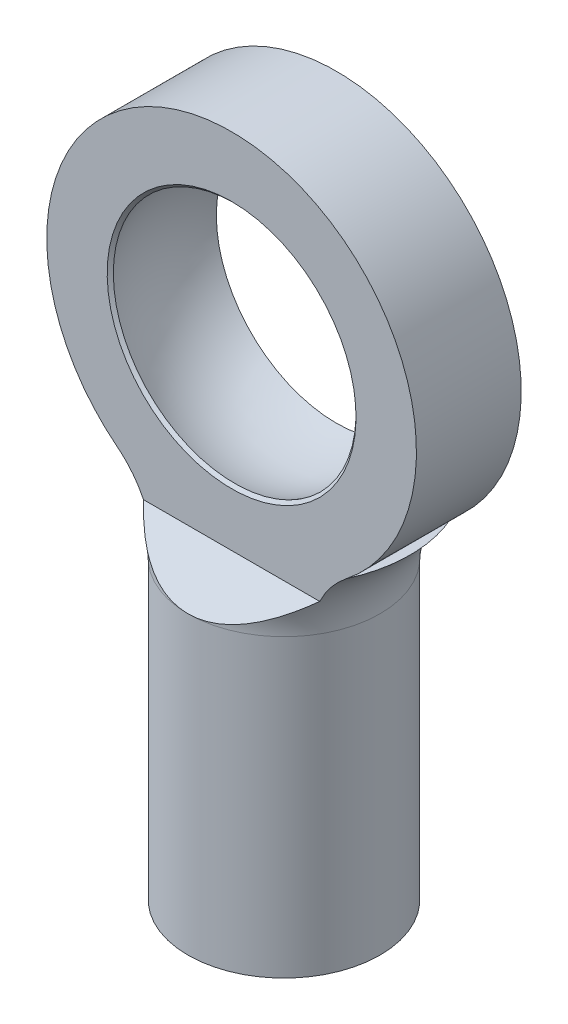
ISO-10303-21;
HEADER;
FILE_DESCRIPTION(('STEP AP214'),'2;1');
FILE_NAME('part.step','',(''),(''),'','','');
FILE_SCHEMA(('AUTOMOTIVE_DESIGN { 1 0 10303 214 1 1 1 1 }'));
ENDSEC;
DATA;
#1=APPLICATION_CONTEXT('core data for automotive mechanical design processes');
#2=APPLICATION_PROTOCOL_DEFINITION('international standard','automotive_design',2000,#1);
#3=PRODUCT_CONTEXT('',#1,'mechanical');
#4=PRODUCT('Part','Part','',(#3));
#5=PRODUCT_RELATED_PRODUCT_CATEGORY('part','',(#4));
#6=PRODUCT_DEFINITION_FORMATION('','',#4);
#7=PRODUCT_DEFINITION_CONTEXT('part definition',#1,'design');
#8=PRODUCT_DEFINITION('design','',#6,#7);
#9=PRODUCT_DEFINITION_SHAPE('','',#8);
#10=(LENGTH_UNIT() NAMED_UNIT(*) SI_UNIT(.MILLI.,.METRE.));
#11=(NAMED_UNIT(*) PLANE_ANGLE_UNIT() SI_UNIT($,.RADIAN.));
#12=(NAMED_UNIT(*) SI_UNIT($,.STERADIAN.) SOLID_ANGLE_UNIT());
#13=UNCERTAINTY_MEASURE_WITH_UNIT(LENGTH_MEASURE(1.E-05),#10,'distance_accuracy_value','');
#14=(GEOMETRIC_REPRESENTATION_CONTEXT(3) GLOBAL_UNCERTAINTY_ASSIGNED_CONTEXT((#13)) GLOBAL_UNIT_ASSIGNED_CONTEXT((#10,
#11,#12)) REPRESENTATION_CONTEXT('',''));
#15=CARTESIAN_POINT('',(0.,0.,0.));
#16=DIRECTION('',(0.,0.,1.));
#17=DIRECTION('',(1.,0.,0.));
#18=AXIS2_PLACEMENT_3D('',#15,#16,#17);
#19=CARTESIAN_POINT('',(0.,8.46365176617518,0.));
#20=DIRECTION('',(0.,1.,0.));
#21=DIRECTION('',(0.,0.,1.));
#22=AXIS2_PLACEMENT_3D('',#19,#20,#21);
#23=TOROIDAL_SURFACE('',#22,5.25,2.5);
#24=CARTESIAN_POINT('',(2.52263360876698,9.40698208641616,1.4998));
#25=CARTESIAN_POINT('',(2.43420646961524,9.33691709001427,1.59265746108454));
#26=CARTESIAN_POINT('',(2.34248853626167,9.26818785259467,1.6837446346634));
#27=CARTESIAN_POINT('',(2.15012625601884,9.13447870724579,1.86094997825127));
#28=CARTESIAN_POINT('',(2.04941602731006,9.0695334142214,1.9470222729681));
#29=CARTESIAN_POINT('',(1.83580879928051,8.94430923676506,2.11298244969169));
#30=CARTESIAN_POINT('',(1.72269520534484,8.88416177953119,2.19269615063005));
#31=CARTESIAN_POINT('',(1.48551246500342,8.77271586216841,2.34039593605765));
#32=CARTESIAN_POINT('',(1.36148416179799,8.72138637002678,2.40842314741569));
#33=CARTESIAN_POINT('',(1.11450193706548,8.634654124027,2.52336979083666));
#34=CARTESIAN_POINT('',(0.992597122249493,8.59819301253292,2.57169186912865));
#35=CARTESIAN_POINT('',(0.804178160819459,8.55252332283294,2.63221811835207));
#36=CARTESIAN_POINT('',(0.74061577938278,8.53882754364144,2.65036919733026));
#37=CARTESIAN_POINT('',(0.611834103747568,8.51466087405115,2.6823973953787));
#38=CARTESIAN_POINT('',(0.546615542220467,8.50418858362975,2.69627636990534));
#39=CARTESIAN_POINT('',(0.414232154763943,8.48662523804074,2.71955315236874));
#40=CARTESIAN_POINT('',(0.34705426945471,8.47956971916032,2.72890386390111));
#41=CARTESIAN_POINT('',(0.211933281308076,8.46918817654625,2.74266256994248));
#42=CARTESIAN_POINT('',(0.14399051653232,8.46586056583602,2.74707266767883));
#43=CARTESIAN_POINT('',(0.00778756896621926,8.46302327061933,2.75083294804277));
#44=CARTESIAN_POINT('',(-0.060472920435387,8.46351880170383,2.75017621842373));
#45=CARTESIAN_POINT('',(-0.19660369244508,8.46831898046119,2.74381451950058));
#46=CARTESIAN_POINT('',(-0.264473990150006,8.47262347974997,2.73810974685057));
#47=CARTESIAN_POINT('',(-0.455322252936812,8.49006323280162,2.71499676214379));
#48=CARTESIAN_POINT('',(-0.577262266475379,8.50756327091419,2.69180388136927));
#49=CARTESIAN_POINT('',(-0.815082505299224,8.55352538282223,2.63089008365232));
#50=CARTESIAN_POINT('',(-0.930963643154768,8.58198580036387,2.59317136175067));
#51=CARTESIAN_POINT('',(-1.20939301297771,8.66390463227651,2.48460395809611));
#52=CARTESIAN_POINT('',(-1.36751851057227,8.72280025637074,2.40654931735925));
#53=CARTESIAN_POINT('',(-1.66690333740199,8.8548923072355,2.23148711650798));
#54=CARTESIAN_POINT('',(-1.80807468477703,8.92815854101835,2.13438704083997));
#55=CARTESIAN_POINT('',(-2.04767221432566,9.06842671254516,1.94848898977549));
#56=CARTESIAN_POINT('',(-2.14896828331774,9.13369750516558,1.86198530895116));
#57=CARTESIAN_POINT('',(-2.34208982908815,9.26788748190653,1.68414271731403));
#58=CARTESIAN_POINT('',(-2.43400878357452,9.33675753578726,1.59286891903339));
#59=CARTESIAN_POINT('',(-2.52263360876698,9.40698208641616,1.4998));
#60=B_SPLINE_CURVE_WITH_KNOTS('',3,(#24,#25,#26,#27,#28,#29,#30,#31,#32,#33,#34,#35,#36,#37,#38,
#39,#40,#41,#42,#43,#44,#45,#46,#47,#48,#49,#50,#51,#52,#53,#54,#55,#56,#57,#58,#59),
.UNSPECIFIED.,.F.,.F.,(4,2,2,2,2,2,2,2,2,2,2,2,2,2,2,2,2,4),(0.,0.438649435214271,
0.880828099093525,1.33257745542061,1.78270292227348,2.18943457857803,2.39176026146898,
2.59399794606545,2.79829610062513,3.0025072520403,3.20699704077256,3.41147886364837,
3.78575683276633,4.15997826586447,4.71454165414465,5.27186877583573,5.71644932768592,
6.15604355948166),.UNSPECIFIED.);
#61=CARTESIAN_POINT('',(-8.2650900012915E-12,8.46365176617518,2.75));
#62=VERTEX_POINT('',#61);
#63=CARTESIAN_POINT('',(-2.52244315909278,9.40683117771543,1.49999999999321));
#64=VERTEX_POINT('',#63);
#65=EDGE_CURVE('E182',#62,#64,#60,.T.);
#66=ORIENTED_EDGE('',*,*,#65,.T.);
#67=CARTESIAN_POINT('',(-2.77520054373101,9.82727055229815,1.5));
#68=CARTESIAN_POINT('',(-2.86880798947521,9.95380541119137,1.5));
#69=CARTESIAN_POINT('',(-2.97382506706745,10.0721303335961,1.5));
#70=CARTESIAN_POINT('',(-3.20236643724194,10.2896798704027,1.5));
#71=CARTESIAN_POINT('',(-3.32593956265058,10.3888524595779,1.5));
#72=CARTESIAN_POINT('',(-3.58740941147698,10.5653509574533,1.5));
#73=CARTESIAN_POINT('',(-3.72527160981674,10.6427279194851,1.5));
#74=CARTESIAN_POINT('',(-4.01174098843791,10.7737187344324,1.5));
#75=CARTESIAN_POINT('',(-4.16034032384121,10.8273497366869,1.5));
#76=CARTESIAN_POINT('',(-4.46748460299527,10.9098871456197,1.5));
#77=CARTESIAN_POINT('',(-4.62616892097153,10.9382782667874,1.5));
#78=CARTESIAN_POINT('',(-4.94610453208784,10.9670155786189,1.5));
#79=CARTESIAN_POINT('',(-5.10735590875208,10.967360854884,1.5));
#80=CARTESIAN_POINT('',(-5.42192086971607,10.9398059535283,1.5));
#81=CARTESIAN_POINT('',(-5.57531804169709,10.9128647009825,1.5));
#82=CARTESIAN_POINT('',(-5.87498986714995,10.8324257276257,1.5));
#83=CARTESIAN_POINT('',(-6.02126642881333,10.7789351650378,1.5));
#84=CARTESIAN_POINT('',(-6.29580090034785,10.6494857550717,1.5));
#85=CARTESIAN_POINT('',(-6.42456452256022,10.5745988452261,1.5));
#86=CARTESIAN_POINT('',(-6.6670897667117,10.4035459774789,1.5));
#87=CARTESIAN_POINT('',(-6.78085443602482,10.3073843526789,1.5));
#88=CARTESIAN_POINT('',(-6.98607910131235,10.1001251056968,1.5));
#89=CARTESIAN_POINT('',(-7.07816861114006,9.98965041030686,1.5));
#90=CARTESIAN_POINT('',(-7.24198175580442,9.75451040876,1.5));
#91=CARTESIAN_POINT('',(-7.31370816219457,9.62984703701489,1.5));
#92=CARTESIAN_POINT('',(-7.43313524406139,9.37291285809918,1.5));
#93=CARTESIAN_POINT('',(-7.48133976600618,9.24087606158923,1.5));
#94=CARTESIAN_POINT('',(-7.55459367515231,8.97052922637443,1.5));
#95=CARTESIAN_POINT('',(-7.57964491871713,8.83221969153273,1.5));
#96=CARTESIAN_POINT('',(-7.60565180707718,8.55503757836966,1.5));
#97=CARTESIAN_POINT('',(-7.60689355342739,8.41619176605415,1.5));
#98=CARTESIAN_POINT('',(-7.58597634289377,8.1402774483205,1.5));
#99=CARTESIAN_POINT('',(-7.563818114773,8.00320888768664,1.5));
#100=CARTESIAN_POINT('',(-7.49687562817931,7.73512547110418,1.5));
#101=CARTESIAN_POINT('',(-7.45215462723152,7.60409480194225,1.5));
#102=CARTESIAN_POINT('',(-7.34147549722097,7.35133957544266,1.5));
#103=CARTESIAN_POINT('',(-7.27551714570415,7.22961511560091,1.5));
#104=CARTESIAN_POINT('',(-7.12387899488294,6.99810068682845,1.5));
#105=CARTESIAN_POINT('',(-7.03808317065674,6.88838675698003,1.5));
#106=CARTESIAN_POINT('',(-6.84953999725341,6.68465892661047,1.5));
#107=CARTESIAN_POINT('',(-6.74679175461202,6.59064585411681,1.5));
#108=CARTESIAN_POINT('',(-6.52565033229582,6.4194015986411,1.5));
#109=CARTESIAN_POINT('',(-6.40704380590824,6.34244609678727,1.5));
#110=CARTESIAN_POINT('',(-6.15884729547815,6.20898713767554,1.5));
#111=CARTESIAN_POINT('',(-6.02925628800726,6.15248558871104,1.5));
#112=CARTESIAN_POINT('',(-5.75932248071202,6.0599411383845,1.5));
#113=CARTESIAN_POINT('',(-5.61879126688184,6.02444837654625,1.5));
#114=CARTESIAN_POINT('',(-5.33384831810342,5.97668574538999,1.5));
#115=CARTESIAN_POINT('',(-5.18943597569307,5.96441953314131,1.5));
#116=CARTESIAN_POINT('',(-4.8953594391388,5.96292805390488,1.5));
#117=CARTESIAN_POINT('',(-4.74569122046875,5.97453820487662,1.5));
#118=CARTESIAN_POINT('',(-4.45017719081841,6.02165792578331,1.5));
#119=CARTESIAN_POINT('',(-4.3043321014034,6.0571719739996,1.5));
#120=CARTESIAN_POINT('',(-4.0140268684584,6.15274664286522,1.5));
#121=CARTESIAN_POINT('',(-3.86988871883762,6.21378587844086,1.5));
#122=CARTESIAN_POINT('',(-3.59340112230231,6.35846727918727,1.5));
#123=CARTESIAN_POINT('',(-3.46105594439179,6.44211758562454,1.5));
#124=CARTESIAN_POINT('',(-3.20791018754112,6.63279289406282,1.5));
#125=CARTESIAN_POINT('',(-3.08758900063503,6.7404568810613,1.5));
#126=CARTESIAN_POINT('',(-2.86736160654152,6.97509890635906,1.5));
#127=CARTESIAN_POINT('',(-2.76746281009798,7.10208392669649,1.5));
#128=CARTESIAN_POINT('',(-2.59605067812521,7.36789588024765,1.5));
#129=CARTESIAN_POINT('',(-2.52365681131358,7.50614362139373,1.5));
#130=CARTESIAN_POINT('',(-2.43670549947174,7.72193847798248,1.5));
#131=CARTESIAN_POINT('',(-2.41133376282467,7.79524495987107,1.5));
#132=CARTESIAN_POINT('',(-2.36834857550259,7.94411977978145,1.5));
#133=CARTESIAN_POINT('',(-2.35073326437184,8.01968757075651,1.5));
#134=CARTESIAN_POINT('',(-2.32574664143934,8.16110337264975,1.5));
#135=CARTESIAN_POINT('',(-2.31725344935535,8.22675543213059,1.5));
#136=CARTESIAN_POINT('',(-2.30648264596507,8.3585651538826,1.5));
#137=CARTESIAN_POINT('',(-2.30420423543323,8.42472275004395,1.5));
#138=CARTESIAN_POINT('',(-2.30592084310208,8.55696206180351,1.5));
#139=CARTESIAN_POINT('',(-2.30991621870201,8.62304377286416,1.5));
#140=CARTESIAN_POINT('',(-2.32407538106441,8.7545237966183,1.5));
#141=CARTESIAN_POINT('',(-2.33423889655187,8.81992213923771,1.5));
#142=CARTESIAN_POINT('',(-2.37098053060611,9.00105122056472,1.5));
#143=CARTESIAN_POINT('',(-2.40418453837801,9.11548852572648,1.5));
#144=CARTESIAN_POINT('',(-2.48771610718511,9.33771626447226,1.5));
#145=CARTESIAN_POINT('',(-2.53802751481908,9.44551285544807,1.5));
#146=CARTESIAN_POINT('',(-2.62255611721408,9.59736306870057,1.5));
#147=CARTESIAN_POINT('',(-2.65101768207202,9.64471203174347,1.5));
#148=CARTESIAN_POINT('',(-2.7109186076383,9.73746744652141,1.5));
#149=CARTESIAN_POINT('',(-2.74235729104561,9.78287433668623,1.5));
#150=CARTESIAN_POINT('',(-2.77520054373101,9.82727055229815,1.5));
#151=B_SPLINE_CURVE_WITH_KNOTS('',3,(#67,#68,#69,#70,#71,#72,#73,#74,#75,#76,#77,#78,#79,#80,
#81,#82,#83,#84,#85,#86,#87,#88,#89,#90,#91,#92,#93,#94,#95,#96,#97,#98,#99,#100,#101,#102,#103,
#104,#105,#106,#107,#108,#109,#110,#111,#112,#113,#114,#115,#116,#117,#118,#119,#120,#121,#122,
#123,#124,#125,#126,#127,#128,#129,#130,#131,#132,#133,#134,#135,#136,#137,#138,#139,#140,#141,
#142,#143,#144,#145,#146,#147,#148,#149,#150),.UNSPECIFIED.,.T.,.F.,(4,2,2,2,2,2,2,2,2,2,2,2,2,
2,2,2,2,2,2,2,2,2,2,2,2,2,2,2,2,2,2,2,2,2,2,2,2,2,2,2,2,4),(0.,0.471976963857071,
0.945218504166764,1.41734214257615,1.88912425477586,2.37033044137583,2.85155231707796,
3.31643006210589,3.78118253485925,4.22583228867175,4.67039156222801,5.09975432353878,
5.52905861768114,5.94871225437454,6.36833224152265,6.78290675548257,7.19746835841636,
7.61087409220699,8.02428415642337,8.44017622583875,8.85609022153378,9.27830229258901,
9.70055374463809,10.1334223929888,10.5663591917575,11.0147015633729,11.4631279531847,
11.93060273411,12.398246057164,12.880251707864,13.3624319563729,13.8275232209248,
14.0598949739912,14.2922109599811,14.4905292640561,14.6888220630464,14.8871261586072,
15.0854215333785,15.4412666911813,15.7967767763951,15.962412933836,16.1280114988049),.UNSPECIFIED.);
#152=CARTESIAN_POINT('',(-3.28292368029246,10.3500105892454,1.5));
#153=VERTEX_POINT('',#152);
#154=EDGE_CURVE('E123',#64,#153,#151,.T.);
#155=ORIENTED_EDGE('',*,*,#154,.T.);
#156=CARTESIAN_POINT('',(0.,10.3500105892454,0.));
#157=DIRECTION('',(0.,1.,0.));
#158=DIRECTION('',(0.,0.,1.));
#159=AXIS2_PLACEMENT_3D('',#156,#157,#158);
#160=CIRCLE('',#159,3.609375);
#161=CARTESIAN_POINT('',(-3.28292368029246,10.3500105892454,-1.5));
#162=VERTEX_POINT('',#161);
#163=EDGE_CURVE('E72',#162,#153,#160,.T.);
#164=ORIENTED_EDGE('',*,*,#163,.F.);
#165=CARTESIAN_POINT('',(-2.77520054373101,9.82727055229815,-1.5));
#166=CARTESIAN_POINT('',(-2.69722034650861,9.72186186116174,-1.5));
#167=CARTESIAN_POINT('',(-2.62706139265087,9.61064779976969,-1.5));
#168=CARTESIAN_POINT('',(-2.50530030107028,9.37833661741164,-1.5));
#169=CARTESIAN_POINT('',(-2.45369290972097,9.25724230637637,-1.5));
#170=CARTESIAN_POINT('',(-2.3924360207345,9.06997176813836,-1.5));
#171=CARTESIAN_POINT('',(-2.37467475666705,9.00636920123968,-1.5));
#172=CARTESIAN_POINT('',(-2.34498059489164,8.87782802698144,-1.5));
#173=CARTESIAN_POINT('',(-2.33304503535153,8.8128900439502,-1.5));
#174=CARTESIAN_POINT('',(-2.31526983974161,8.68221169683337,-1.5));
#175=CARTESIAN_POINT('',(-2.30942735265512,8.61647172258986,-1.5));
#176=CARTESIAN_POINT('',(-2.30395456671406,8.4847531751108,-1.5));
#177=CARTESIAN_POINT('',(-2.30432379631015,8.41877462036674,-1.5));
#178=CARTESIAN_POINT('',(-2.31419008285242,8.23255403516505,-1.5));
#179=CARTESIAN_POINT('',(-2.33099325004656,8.11262477694962,-1.5));
#180=CARTESIAN_POINT('',(-2.38420631342782,7.87727413581764,-1.5));
#181=CARTESIAN_POINT('',(-2.42062521093435,7.76185484854868,-1.5));
#182=CARTESIAN_POINT('',(-2.51154920487191,7.53618351220007,-1.5));
#183=CARTESIAN_POINT('',(-2.5663467685798,7.42605025810996,-1.5));
#184=CARTESIAN_POINT('',(-2.69131596910597,7.21492813038099,-1.5));
#185=CARTESIAN_POINT('',(-2.7614930688756,7.11394252413046,-1.5));
#186=CARTESIAN_POINT('',(-2.92628460654182,6.90834392927876,-1.5));
#187=CARTESIAN_POINT('',(-3.02297704222449,6.80539494114581,-1.5));
#188=CARTESIAN_POINT('',(-3.23065794842618,6.61508249080304,-1.5));
#189=CARTESIAN_POINT('',(-3.3416540953024,6.52772745786798,-1.5));
#190=CARTESIAN_POINT('',(-3.58876728132312,6.36116685082386,-1.5));
#191=CARTESIAN_POINT('',(-3.72630522698038,6.28405850344012,-1.5));
#192=CARTESIAN_POINT('',(-4.0121818308107,6.15342791569902,-1.5));
#193=CARTESIAN_POINT('',(-4.16052239081474,6.09990984023008,-1.5));
#194=CARTESIAN_POINT('',(-4.46740851493264,6.01743175994389,-1.5));
#195=CARTESIAN_POINT('',(-4.62610623958721,5.98903391648114,-1.5));
#196=CARTESIAN_POINT('',(-4.94603939287148,5.96029078631035,-1.5));
#197=CARTESIAN_POINT('',(-5.10727443959866,5.95994131756622,-1.5));
#198=CARTESIAN_POINT('',(-5.42182291832866,5.98748342031241,-1.5));
#199=CARTESIAN_POINT('',(-5.57521966679189,6.01441864767564,-1.5));
#200=CARTESIAN_POINT('',(-5.87489596592004,6.09484638577298,-1.5));
#201=CARTESIAN_POINT('',(-6.02117722625271,6.14833248206549,-1.5));
#202=CARTESIAN_POINT('',(-6.29571958434771,6.27777352749429,-1.5));
#203=CARTESIAN_POINT('',(-6.4244865206929,6.35265617083908,-1.5));
#204=CARTESIAN_POINT('',(-6.66701889819784,6.52370108136527,-1.5));
#205=CARTESIAN_POINT('',(-6.78078740538716,6.61985898858738,-1.5));
#206=CARTESIAN_POINT('',(-6.98602017953239,6.82711167495004,-1.5));
#207=CARTESIAN_POINT('',(-7.07811394054991,6.93758350249161,-1.5));
#208=CARTESIAN_POINT('',(-7.24193587049002,7.172718413161,-1.5));
#209=CARTESIAN_POINT('',(-7.31366683731026,7.29737954334314,-1.5));
#210=CARTESIAN_POINT('',(-7.43310317558629,7.55431000148409,-1.5));
#211=CARTESIAN_POINT('',(-7.48131240603414,7.68634529142251,-1.5));
#212=CARTESIAN_POINT('',(-7.55457592855433,7.95669003412192,-1.5));
#213=CARTESIAN_POINT('',(-7.57963206094283,8.09499898730599,-1.5));
#214=CARTESIAN_POINT('',(-7.60564863458145,8.3721806081364,-1.5));
#215=CARTESIAN_POINT('',(-7.60689520689484,8.51102649697411,-1.5));
#216=CARTESIAN_POINT('',(-7.58598754395391,8.78694174686641,-1.5));
#217=CARTESIAN_POINT('',(-7.56383404244838,8.92401116348888,-1.5));
#218=CARTESIAN_POINT('',(-7.49690078498283,9.19209694618953,-1.5));
#219=CARTESIAN_POINT('',(-7.45218430659433,9.32312912817396,-1.5));
#220=CARTESIAN_POINT('',(-7.34151388165661,9.5758881168649,-1.5));
#221=CARTESIAN_POINT('',(-7.27555971058974,9.69761482518027,-1.5));
#222=CARTESIAN_POINT('',(-7.12392951934685,9.92913435850688,-1.5));
#223=CARTESIAN_POINT('',(-7.03813747980046,10.0388511537427,-1.5));
#224=CARTESIAN_POINT('',(-6.84960142419803,10.242585167419,-1.5));
#225=CARTESIAN_POINT('',(-6.74685653251839,10.3366015744214,-1.5));
#226=CARTESIAN_POINT('',(-6.52572170050084,10.5078526963465,-1.5));
#227=CARTESIAN_POINT('',(-6.40711846141554,10.5848118113331,-1.5));
#228=CARTESIAN_POINT('',(-6.15892702750739,10.7182790010088,-1.5));
#229=CARTESIAN_POINT('',(-6.02933773183651,10.7747850232171,-1.5));
#230=CARTESIAN_POINT('',(-5.75940481341771,10.8673392868139,-1.5));
#231=CARTESIAN_POINT('',(-5.61887265417873,10.9028370904131,-1.5));
#232=CARTESIAN_POINT('',(-5.33393196857855,10.9506081882319,-1.5));
#233=CARTESIAN_POINT('',(-5.18952297244285,10.962878654886,-1.5));
#234=CARTESIAN_POINT('',(-4.89546202112646,10.9643800314809,-1.5));
#235=CARTESIAN_POINT('',(-4.74580603691271,10.9527770745068,-1.5));
#236=CARTESIAN_POINT('',(-4.45029018008411,10.9056701832517,-1.5));
#237=CARTESIAN_POINT('',(-4.30443162669497,10.8701580550426,-1.5));
#238=CARTESIAN_POINT('',(-4.01407176333231,10.774578202881,-1.5));
#239=CARTESIAN_POINT('',(-3.86989453295576,10.7135264190289,-1.5));
#240=CARTESIAN_POINT('',(-3.5933968767176,10.5688283072943,-1.5));
#241=CARTESIAN_POINT('',(-3.46107354340499,10.4851875402164,-1.5));
#242=CARTESIAN_POINT('',(-3.23014683330539,10.3112697479837,-1.5));
#243=CARTESIAN_POINT('',(-3.12944408304694,10.2237640109109,-1.5));
#244=CARTESIAN_POINT('',(-2.94154436047935,10.0352535774415,-1.5));
#245=CARTESIAN_POINT('',(-2.85434426126542,9.93425201649195,-1.5));
#246=CARTESIAN_POINT('',(-2.77520054373101,9.82727055229815,-1.5));
#247=B_SPLINE_CURVE_WITH_KNOTS('',3,(#165,#166,#167,#168,#169,#170,#171,#172,#173,#174,#175,
#176,#177,#178,#179,#180,#181,#182,#183,#184,#185,#186,#187,#188,#189,#190,#191,#192,#193,#194,
#195,#196,#197,#198,#199,#200,#201,#202,#203,#204,#205,#206,#207,#208,#209,#210,#211,#212,#213,
#214,#215,#216,#217,#218,#219,#220,#221,#222,#223,#224,#225,#226,#227,#228,#229,#230,#231,#232,
#233,#234,#235,#236,#237,#238,#239,#240,#241,#242,#243,#244,#245,#246),.UNSPECIFIED.,.T.,.F.,(4,
2,2,2,2,2,2,2,2,2,2,2,2,2,2,2,2,2,2,2,2,2,2,2,2,2,2,2,2,2,2,2,2,2,2,2,2,2,2,2,4),(0.,
0.392995195572737,0.785879010797342,0.983760634387621,1.18155175872764,1.37925029281033,
1.57693381909417,1.93833196731216,2.2998960963567,2.66751087725509,3.03525645053411,
3.45727219546463,3.87951537374347,4.35038777813755,4.82134328230716,5.30258945800965,
5.78376387937189,6.24863715455139,6.71339817531439,7.15805006912917,7.60261092428622,
8.03197522850198,8.46128050842698,8.88093473980528,9.30055561223912,9.71513048099302,
10.1296923504384,10.5430979954155,10.9565080109197,11.372399854183,11.7883131852039,
12.2105229082787,12.6327749886226,13.0656500300317,13.4985777638306,13.9468834632717,
14.3953428801167,14.8629574498509,15.3304570101226,15.7294085017192,16.1282674666701),.UNSPECIFIED.);
#248=CARTESIAN_POINT('',(-2.52244315908632,9.40683117771031,-1.5));
#249=VERTEX_POINT('',#248);
#250=EDGE_CURVE('E175',#162,#249,#247,.T.);
#251=ORIENTED_EDGE('',*,*,#250,.T.);
#252=CARTESIAN_POINT('',(-2.52263360876698,9.40698208641616,-1.4998));
#253=CARTESIAN_POINT('',(-2.43420646961524,9.33691709001427,-1.59265746108454));
#254=CARTESIAN_POINT('',(-2.34248853626167,9.26818785259467,-1.6837446346634));
#255=CARTESIAN_POINT('',(-2.15012625601884,9.13447870724579,-1.86094997825127));
#256=CARTESIAN_POINT('',(-2.04941602731006,9.0695334142214,-1.9470222729681));
#257=CARTESIAN_POINT('',(-1.83580879928051,8.94430923676506,-2.11298244969169));
#258=CARTESIAN_POINT('',(-1.72269520534484,8.88416177953119,-2.19269615063005));
#259=CARTESIAN_POINT('',(-1.48551246500342,8.77271586216841,-2.34039593605765));
#260=CARTESIAN_POINT('',(-1.36148416179799,8.72138637002678,-2.40842314741569));
#261=CARTESIAN_POINT('',(-1.11450193706548,8.634654124027,-2.52336979083666));
#262=CARTESIAN_POINT('',(-0.992597122249493,8.59819301253292,-2.57169186912865));
#263=CARTESIAN_POINT('',(-0.804178160819459,8.55252332283294,-2.63221811835207));
#264=CARTESIAN_POINT('',(-0.74061577938278,8.53882754364144,-2.65036919733026));
#265=CARTESIAN_POINT('',(-0.611834103747568,8.51466087405115,-2.6823973953787));
#266=CARTESIAN_POINT('',(-0.546615542220467,8.50418858362975,-2.69627636990534));
#267=CARTESIAN_POINT('',(-0.414232154763943,8.48662523804074,-2.71955315236874));
#268=CARTESIAN_POINT('',(-0.34705426945471,8.47956971916032,-2.72890386390111));
#269=CARTESIAN_POINT('',(-0.211933281308076,8.46918817654625,-2.74266256994248));
#270=CARTESIAN_POINT('',(-0.14399051653232,8.46586056583602,-2.74707266767883));
#271=CARTESIAN_POINT('',(-0.00778756896621926,8.46302327061933,-2.75083294804277));
#272=CARTESIAN_POINT('',(0.060472920435387,8.46351880170383,-2.75017621842373));
#273=CARTESIAN_POINT('',(0.19660369244508,8.46831898046119,-2.74381451950058));
#274=CARTESIAN_POINT('',(0.264473990150006,8.47262347974997,-2.73810974685057));
#275=CARTESIAN_POINT('',(0.455322252936812,8.49006323280162,-2.71499676214379));
#276=CARTESIAN_POINT('',(0.577262266475379,8.50756327091419,-2.69180388136927));
#277=CARTESIAN_POINT('',(0.815082505299224,8.55352538282223,-2.63089008365232));
#278=CARTESIAN_POINT('',(0.930963643154768,8.58198580036387,-2.59317136175067));
#279=CARTESIAN_POINT('',(1.20939301297771,8.66390463227651,-2.48460395809611));
#280=CARTESIAN_POINT('',(1.36751851057227,8.72280025637074,-2.40654931735925));
#281=CARTESIAN_POINT('',(1.66690333740199,8.8548923072355,-2.23148711650798));
#282=CARTESIAN_POINT('',(1.80807468477703,8.92815854101835,-2.13438704083997));
#283=CARTESIAN_POINT('',(2.04767221432566,9.06842671254516,-1.94848898977549));
#284=CARTESIAN_POINT('',(2.14896828331774,9.13369750516558,-1.86198530895116));
#285=CARTESIAN_POINT('',(2.34208982908815,9.26788748190653,-1.68414271731403));
#286=CARTESIAN_POINT('',(2.43400878357452,9.33675753578726,-1.59286891903339));
#287=CARTESIAN_POINT('',(2.52263360876698,9.40698208641616,-1.4998));
#288=B_SPLINE_CURVE_WITH_KNOTS('',3,(#252,#253,#254,#255,#256,#257,#258,#259,#260,#261,#262,
#263,#264,#265,#266,#267,#268,#269,#270,#271,#272,#273,#274,#275,#276,#277,#278,#279,#280,#281,
#282,#283,#284,#285,#286,#287),.UNSPECIFIED.,.F.,.F.,(4,2,2,2,2,2,2,2,2,2,2,2,2,2,2,2,2,4),(0.,
0.438649435214271,0.880828099093525,1.33257745542061,1.78270292227348,2.18943457857803,
2.39176026146898,2.59399794606545,2.79829610062513,3.0025072520403,3.20699704077256,
3.41147886364837,3.78575683276633,4.15997826586447,4.71454165414465,5.27186877583573,
5.71644932768592,6.15604355948166),.UNSPECIFIED.);
#289=CARTESIAN_POINT('',(-1.43201422941885E-12,8.46365176617518,-2.75));
#290=VERTEX_POINT('',#289);
#291=EDGE_CURVE('E183',#249,#290,#288,.T.);
#292=ORIENTED_EDGE('',*,*,#291,.T.);
#293=CARTESIAN_POINT('',(0.,8.46365176617518,0.));
#294=DIRECTION('',(0.,1.,0.));
#295=DIRECTION('',(0.,0.,1.));
#296=AXIS2_PLACEMENT_3D('',#293,#294,#295);
#297=CIRCLE('',#296,2.75);
#298=EDGE_CURVE('E131',#290,#62,#297,.T.);
#299=ORIENTED_EDGE('',*,*,#298,.T.);
#300=EDGE_LOOP('',(#66,#155,#164,#251,#292,#299));
#301=FACE_BOUND('',#300,.T.);
#302=ADVANCED_FACE('F48',(#301),#23,.F.);
#303=CARTESIAN_POINT('',(0.,0.,0.));
#304=DIRECTION('',(0.,1.,0.));
#305=DIRECTION('',(0.,0.,1.));
#306=AXIS2_PLACEMENT_3D('',#303,#304,#305);
#307=PLANE('',#306);
#308=CARTESIAN_POINT('',(0.,0.,0.));
#309=DIRECTION('',(0.,-1.,0.));
#310=DIRECTION('',(0.,0.,-1.));
#311=AXIS2_PLACEMENT_3D('',#308,#309,#310);
#312=CIRCLE('',#311,1.5);
#313=CARTESIAN_POINT('',(0.,0.,-1.5));
#314=VERTEX_POINT('',#313);
#315=EDGE_CURVE('E258',#314,#314,#312,.T.);
#316=ORIENTED_EDGE('',*,*,#315,.F.);
#317=EDGE_LOOP('',(#316));
#318=FACE_BOUND('',#317,.T.);
#319=CARTESIAN_POINT('',(0.,0.,0.));
#320=DIRECTION('',(0.,1.,0.));
#321=DIRECTION('',(0.,0.,1.));
#322=AXIS2_PLACEMENT_3D('',#319,#320,#321);
#323=CIRCLE('',#322,2.75);
#324=CARTESIAN_POINT('',(0.,0.,2.75));
#325=VERTEX_POINT('',#324);
#326=EDGE_CURVE('E144',#325,#325,#323,.T.);
#327=ORIENTED_EDGE('',*,*,#326,.F.);
#328=EDGE_LOOP('',(#327));
#329=FACE_BOUND('',#328,.T.);
#330=ADVANCED_FACE('F224',(#318,#329),#307,.F.);
#331=CARTESIAN_POINT('',(0.,0.,0.));
#332=DIRECTION('',(0.,1.,0.));
#333=DIRECTION('',(0.,0.,1.));
#334=AXIS2_PLACEMENT_3D('',#331,#332,#333);
#335=CYLINDRICAL_SURFACE('',#334,2.75);
#336=EDGE_CURVE('E137',#62,#290,#297,.T.);
#337=ORIENTED_EDGE('',*,*,#336,.F.);
#338=ORIENTED_EDGE('',*,*,#298,.F.);
#339=EDGE_LOOP('',(#337,#338));
#340=FACE_BOUND('',#339,.T.);
#341=ORIENTED_EDGE('',*,*,#326,.T.);
#342=EDGE_LOOP('',(#341));
#343=FACE_BOUND('',#342,.T.);
#344=ADVANCED_FACE('F229',(#340,#343),#335,.T.);
#345=CARTESIAN_POINT('',(3.28292368029246,10.3500105892454,1.5));
#346=VERTEX_POINT('',#345);
#347=CARTESIAN_POINT('',(3.28292368029246,10.3500105892454,-1.5));
#348=VERTEX_POINT('',#347);
#349=EDGE_CURVE('E101',#346,#348,#160,.T.);
#350=ORIENTED_EDGE('',*,*,#349,.F.);
#351=CARTESIAN_POINT('',(2.77520054373101,9.82727055229815,1.5));
#352=CARTESIAN_POINT('',(2.69722034650861,9.72186186116174,1.5));
#353=CARTESIAN_POINT('',(2.62706139265087,9.61064779976969,1.5));
#354=CARTESIAN_POINT('',(2.50530030107028,9.37833661741164,1.5));
#355=CARTESIAN_POINT('',(2.45369290972097,9.25724230637637,1.5));
#356=CARTESIAN_POINT('',(2.3924360207345,9.06997176813836,1.5));
#357=CARTESIAN_POINT('',(2.37467475666705,9.00636920123968,1.5));
#358=CARTESIAN_POINT('',(2.34498059489164,8.87782802698144,1.5));
#359=CARTESIAN_POINT('',(2.33304503535153,8.8128900439502,1.5));
#360=CARTESIAN_POINT('',(2.31526983974161,8.68221169683337,1.5));
#361=CARTESIAN_POINT('',(2.30942735265512,8.61647172258986,1.5));
#362=CARTESIAN_POINT('',(2.30395456671406,8.4847531751108,1.5));
#363=CARTESIAN_POINT('',(2.30432379631015,8.41877462036674,1.5));
#364=CARTESIAN_POINT('',(2.31419008285242,8.23255403516505,1.5));
#365=CARTESIAN_POINT('',(2.33099325004656,8.11262477694962,1.5));
#366=CARTESIAN_POINT('',(2.38420631342782,7.87727413581764,1.5));
#367=CARTESIAN_POINT('',(2.42062521093435,7.76185484854868,1.5));
#368=CARTESIAN_POINT('',(2.51154920487191,7.53618351220007,1.5));
#369=CARTESIAN_POINT('',(2.5663467685798,7.42605025810996,1.5));
#370=CARTESIAN_POINT('',(2.69131596910597,7.21492813038099,1.5));
#371=CARTESIAN_POINT('',(2.7614930688756,7.11394252413046,1.5));
#372=CARTESIAN_POINT('',(2.92628460654182,6.90834392927876,1.5));
#373=CARTESIAN_POINT('',(3.02297704222449,6.80539494114581,1.5));
#374=CARTESIAN_POINT('',(3.23065794842618,6.61508249080304,1.5));
#375=CARTESIAN_POINT('',(3.3416540953024,6.52772745786798,1.5));
#376=CARTESIAN_POINT('',(3.58876728132312,6.36116685082386,1.5));
#377=CARTESIAN_POINT('',(3.72630522698038,6.28405850344012,1.5));
#378=CARTESIAN_POINT('',(4.0121818308107,6.15342791569902,1.5));
#379=CARTESIAN_POINT('',(4.16052239081474,6.09990984023008,1.5));
#380=CARTESIAN_POINT('',(4.46740851493264,6.01743175994389,1.5));
#381=CARTESIAN_POINT('',(4.62610623958721,5.98903391648114,1.5));
#382=CARTESIAN_POINT('',(4.94603939287148,5.96029078631035,1.5));
#383=CARTESIAN_POINT('',(5.10727443959866,5.95994131756622,1.5));
#384=CARTESIAN_POINT('',(5.42182291832866,5.98748342031241,1.5));
#385=CARTESIAN_POINT('',(5.57521966679189,6.01441864767564,1.5));
#386=CARTESIAN_POINT('',(5.87489596592004,6.09484638577298,1.5));
#387=CARTESIAN_POINT('',(6.02117722625271,6.14833248206549,1.5));
#388=CARTESIAN_POINT('',(6.29571958434771,6.27777352749429,1.5));
#389=CARTESIAN_POINT('',(6.4244865206929,6.35265617083908,1.5));
#390=CARTESIAN_POINT('',(6.66701889819784,6.52370108136527,1.5));
#391=CARTESIAN_POINT('',(6.78078740538716,6.61985898858738,1.5));
#392=CARTESIAN_POINT('',(6.98602017953239,6.82711167495004,1.5));
#393=CARTESIAN_POINT('',(7.07811394054991,6.93758350249161,1.5));
#394=CARTESIAN_POINT('',(7.24193587049002,7.172718413161,1.5));
#395=CARTESIAN_POINT('',(7.31366683731026,7.29737954334314,1.5));
#396=CARTESIAN_POINT('',(7.43310317558629,7.55431000148409,1.5));
#397=CARTESIAN_POINT('',(7.48131240603414,7.68634529142251,1.5));
#398=CARTESIAN_POINT('',(7.55457592855433,7.95669003412192,1.5));
#399=CARTESIAN_POINT('',(7.57963206094283,8.09499898730599,1.5));
#400=CARTESIAN_POINT('',(7.60564863458145,8.3721806081364,1.5));
#401=CARTESIAN_POINT('',(7.60689520689484,8.51102649697411,1.5));
#402=CARTESIAN_POINT('',(7.58598754395391,8.78694174686641,1.5));
#403=CARTESIAN_POINT('',(7.56383404244838,8.92401116348888,1.5));
#404=CARTESIAN_POINT('',(7.49690078498283,9.19209694618953,1.5));
#405=CARTESIAN_POINT('',(7.45218430659433,9.32312912817396,1.5));
#406=CARTESIAN_POINT('',(7.34151388165661,9.5758881168649,1.5));
#407=CARTESIAN_POINT('',(7.27555971058974,9.69761482518027,1.5));
#408=CARTESIAN_POINT('',(7.12392951934685,9.92913435850688,1.5));
#409=CARTESIAN_POINT('',(7.03813747980046,10.0388511537427,1.5));
#410=CARTESIAN_POINT('',(6.84960142419803,10.242585167419,1.5));
#411=CARTESIAN_POINT('',(6.74685653251839,10.3366015744214,1.5));
#412=CARTESIAN_POINT('',(6.52572170050084,10.5078526963465,1.5));
#413=CARTESIAN_POINT('',(6.40711846141554,10.5848118113331,1.5));
#414=CARTESIAN_POINT('',(6.15892702750739,10.7182790010088,1.5));
#415=CARTESIAN_POINT('',(6.02933773183651,10.7747850232171,1.5));
#416=CARTESIAN_POINT('',(5.75940481341771,10.8673392868139,1.5));
#417=CARTESIAN_POINT('',(5.61887265417873,10.9028370904131,1.5));
#418=CARTESIAN_POINT('',(5.33393196857855,10.9506081882319,1.5));
#419=CARTESIAN_POINT('',(5.18952297244285,10.962878654886,1.5));
#420=CARTESIAN_POINT('',(4.89546202112646,10.9643800314809,1.5));
#421=CARTESIAN_POINT('',(4.74580603691271,10.9527770745068,1.5));
#422=CARTESIAN_POINT('',(4.45029018008411,10.9056701832517,1.5));
#423=CARTESIAN_POINT('',(4.30443162669497,10.8701580550426,1.5));
#424=CARTESIAN_POINT('',(4.01407176333231,10.774578202881,1.5));
#425=CARTESIAN_POINT('',(3.86989453295576,10.7135264190289,1.5));
#426=CARTESIAN_POINT('',(3.5933968767176,10.5688283072943,1.5));
#427=CARTESIAN_POINT('',(3.46107354340499,10.4851875402164,1.5));
#428=CARTESIAN_POINT('',(3.23014683330539,10.3112697479837,1.5));
#429=CARTESIAN_POINT('',(3.12944408304694,10.2237640109109,1.5));
#430=CARTESIAN_POINT('',(2.94154436047935,10.0352535774415,1.5));
#431=CARTESIAN_POINT('',(2.85434426126542,9.93425201649195,1.5));
#432=CARTESIAN_POINT('',(2.77520054373101,9.82727055229815,1.5));
#433=B_SPLINE_CURVE_WITH_KNOTS('',3,(#351,#352,#353,#354,#355,#356,#357,#358,#359,#360,#361,
#362,#363,#364,#365,#366,#367,#368,#369,#370,#371,#372,#373,#374,#375,#376,#377,#378,#379,#380,
#381,#382,#383,#384,#385,#386,#387,#388,#389,#390,#391,#392,#393,#394,#395,#396,#397,#398,#399,
#400,#401,#402,#403,#404,#405,#406,#407,#408,#409,#410,#411,#412,#413,#414,#415,#416,#417,#418,
#419,#420,#421,#422,#423,#424,#425,#426,#427,#428,#429,#430,#431,#432),.UNSPECIFIED.,.T.,.F.,(4,
2,2,2,2,2,2,2,2,2,2,2,2,2,2,2,2,2,2,2,2,2,2,2,2,2,2,2,2,2,2,2,2,2,2,2,2,2,2,2,4),(0.,
0.392995195572737,0.785879010797342,0.983760634387621,1.18155175872764,1.37925029281033,
1.57693381909417,1.93833196731216,2.2998960963567,2.66751087725509,3.03525645053411,
3.45727219546463,3.87951537374347,4.35038777813755,4.82134328230716,5.30258945800965,
5.78376387937189,6.24863715455139,6.71339817531439,7.15805006912917,7.60261092428622,
8.03197522850198,8.46128050842698,8.88093473980528,9.30055561223912,9.71513048099302,
10.1296923504384,10.5430979954155,10.9565080109197,11.372399854183,11.7883131852039,
12.2105229082787,12.6327749886226,13.0656500300317,13.4985777638306,13.9468834632717,
14.3953428801167,14.8629574498509,15.3304570101226,15.7294085017192,16.1282674666701),.UNSPECIFIED.);
#434=CARTESIAN_POINT('',(2.52244315908632,9.40683117771031,1.5));
#435=VERTEX_POINT('',#434);
#436=EDGE_CURVE('E118',#346,#435,#433,.T.);
#437=ORIENTED_EDGE('',*,*,#436,.T.);
#438=EDGE_CURVE('E124',#435,#62,#60,.T.);
#439=ORIENTED_EDGE('',*,*,#438,.T.);
#440=ORIENTED_EDGE('',*,*,#336,.T.);
#441=CARTESIAN_POINT('',(2.52244315908639,9.40683117771031,-1.5));
#442=VERTEX_POINT('',#441);
#443=EDGE_CURVE('E155',#290,#442,#288,.T.);
#444=ORIENTED_EDGE('',*,*,#443,.T.);
#445=CARTESIAN_POINT('',(2.77520054373101,9.82727055229815,-1.5));
#446=CARTESIAN_POINT('',(2.86880798947521,9.95380541119137,-1.5));
#447=CARTESIAN_POINT('',(2.97382506706745,10.0721303335961,-1.5));
#448=CARTESIAN_POINT('',(3.20236643724194,10.2896798704027,-1.5));
#449=CARTESIAN_POINT('',(3.32593956265058,10.3888524595779,-1.5));
#450=CARTESIAN_POINT('',(3.58740941147698,10.5653509574533,-1.5));
#451=CARTESIAN_POINT('',(3.72527160981674,10.6427279194851,-1.5));
#452=CARTESIAN_POINT('',(4.01174098843791,10.7737187344324,-1.5));
#453=CARTESIAN_POINT('',(4.16034032384121,10.8273497366869,-1.5));
#454=CARTESIAN_POINT('',(4.46748460299527,10.9098871456197,-1.5));
#455=CARTESIAN_POINT('',(4.62616892097153,10.9382782667874,-1.5));
#456=CARTESIAN_POINT('',(4.94610453208784,10.9670155786189,-1.5));
#457=CARTESIAN_POINT('',(5.10735590875208,10.967360854884,-1.5));
#458=CARTESIAN_POINT('',(5.42192086971607,10.9398059535283,-1.5));
#459=CARTESIAN_POINT('',(5.57531804169709,10.9128647009825,-1.5));
#460=CARTESIAN_POINT('',(5.87498986714995,10.8324257276257,-1.5));
#461=CARTESIAN_POINT('',(6.02126642881333,10.7789351650378,-1.5));
#462=CARTESIAN_POINT('',(6.29580090034785,10.6494857550717,-1.5));
#463=CARTESIAN_POINT('',(6.42456452256022,10.5745988452261,-1.5));
#464=CARTESIAN_POINT('',(6.6670897667117,10.4035459774789,-1.5));
#465=CARTESIAN_POINT('',(6.78085443602482,10.3073843526789,-1.5));
#466=CARTESIAN_POINT('',(6.98607910131235,10.1001251056968,-1.5));
#467=CARTESIAN_POINT('',(7.07816861114006,9.98965041030686,-1.5));
#468=CARTESIAN_POINT('',(7.24198175580442,9.75451040876,-1.5));
#469=CARTESIAN_POINT('',(7.31370816219457,9.62984703701489,-1.5));
#470=CARTESIAN_POINT('',(7.43313524406139,9.37291285809918,-1.5));
#471=CARTESIAN_POINT('',(7.48133976600618,9.24087606158923,-1.5));
#472=CARTESIAN_POINT('',(7.55459367515231,8.97052922637443,-1.5));
#473=CARTESIAN_POINT('',(7.57964491871713,8.83221969153273,-1.5));
#474=CARTESIAN_POINT('',(7.60565180707718,8.55503757836966,-1.5));
#475=CARTESIAN_POINT('',(7.60689355342739,8.41619176605415,-1.5));
#476=CARTESIAN_POINT('',(7.58597634289377,8.1402774483205,-1.5));
#477=CARTESIAN_POINT('',(7.563818114773,8.00320888768664,-1.5));
#478=CARTESIAN_POINT('',(7.49687562817931,7.73512547110418,-1.5));
#479=CARTESIAN_POINT('',(7.45215462723152,7.60409480194225,-1.5));
#480=CARTESIAN_POINT('',(7.34147549722097,7.35133957544266,-1.5));
#481=CARTESIAN_POINT('',(7.27551714570415,7.22961511560091,-1.5));
#482=CARTESIAN_POINT('',(7.12387899488294,6.99810068682845,-1.5));
#483=CARTESIAN_POINT('',(7.03808317065674,6.88838675698003,-1.5));
#484=CARTESIAN_POINT('',(6.84953999725341,6.68465892661047,-1.5));
#485=CARTESIAN_POINT('',(6.74679175461202,6.59064585411681,-1.5));
#486=CARTESIAN_POINT('',(6.52565033229582,6.4194015986411,-1.5));
#487=CARTESIAN_POINT('',(6.40704380590824,6.34244609678727,-1.5));
#488=CARTESIAN_POINT('',(6.15884729547815,6.20898713767554,-1.5));
#489=CARTESIAN_POINT('',(6.02925628800726,6.15248558871104,-1.5));
#490=CARTESIAN_POINT('',(5.75932248071202,6.0599411383845,-1.5));
#491=CARTESIAN_POINT('',(5.61879126688184,6.02444837654625,-1.5));
#492=CARTESIAN_POINT('',(5.33384831810342,5.97668574538999,-1.5));
#493=CARTESIAN_POINT('',(5.18943597569307,5.96441953314131,-1.5));
#494=CARTESIAN_POINT('',(4.8953594391388,5.96292805390488,-1.5));
#495=CARTESIAN_POINT('',(4.74569122046875,5.97453820487662,-1.5));
#496=CARTESIAN_POINT('',(4.45017719081841,6.02165792578331,-1.5));
#497=CARTESIAN_POINT('',(4.3043321014034,6.0571719739996,-1.5));
#498=CARTESIAN_POINT('',(4.0140268684584,6.15274664286522,-1.5));
#499=CARTESIAN_POINT('',(3.86988871883762,6.21378587844086,-1.5));
#500=CARTESIAN_POINT('',(3.59340112230231,6.35846727918727,-1.5));
#501=CARTESIAN_POINT('',(3.46105594439179,6.44211758562454,-1.5));
#502=CARTESIAN_POINT('',(3.20791018754112,6.63279289406282,-1.5));
#503=CARTESIAN_POINT('',(3.08758900063503,6.7404568810613,-1.5));
#504=CARTESIAN_POINT('',(2.86736160654152,6.97509890635906,-1.5));
#505=CARTESIAN_POINT('',(2.76746281009798,7.10208392669649,-1.5));
#506=CARTESIAN_POINT('',(2.59605067812521,7.36789588024765,-1.5));
#507=CARTESIAN_POINT('',(2.52365681131358,7.50614362139373,-1.5));
#508=CARTESIAN_POINT('',(2.43670549947174,7.72193847798248,-1.5));
#509=CARTESIAN_POINT('',(2.41133376282467,7.79524495987107,-1.5));
#510=CARTESIAN_POINT('',(2.36834857550259,7.94411977978145,-1.5));
#511=CARTESIAN_POINT('',(2.35073326437184,8.01968757075651,-1.5));
#512=CARTESIAN_POINT('',(2.32574664143934,8.16110337264975,-1.5));
#513=CARTESIAN_POINT('',(2.31725344935535,8.22675543213059,-1.5));
#514=CARTESIAN_POINT('',(2.30648264596507,8.3585651538826,-1.5));
#515=CARTESIAN_POINT('',(2.30420423543323,8.42472275004395,-1.5));
#516=CARTESIAN_POINT('',(2.30592084310208,8.55696206180351,-1.5));
#517=CARTESIAN_POINT('',(2.30991621870201,8.62304377286416,-1.5));
#518=CARTESIAN_POINT('',(2.32407538106441,8.7545237966183,-1.5));
#519=CARTESIAN_POINT('',(2.33423889655187,8.81992213923771,-1.5));
#520=CARTESIAN_POINT('',(2.37098053060611,9.00105122056472,-1.5));
#521=CARTESIAN_POINT('',(2.40418453837801,9.11548852572648,-1.5));
#522=CARTESIAN_POINT('',(2.48771610718511,9.33771626447226,-1.5));
#523=CARTESIAN_POINT('',(2.53802751481908,9.44551285544807,-1.5));
#524=CARTESIAN_POINT('',(2.62255611721408,9.59736306870057,-1.5));
#525=CARTESIAN_POINT('',(2.65101768207202,9.64471203174347,-1.5));
#526=CARTESIAN_POINT('',(2.7109186076383,9.73746744652141,-1.5));
#527=CARTESIAN_POINT('',(2.74235729104561,9.78287433668623,-1.5));
#528=CARTESIAN_POINT('',(2.77520054373101,9.82727055229815,-1.5));
#529=B_SPLINE_CURVE_WITH_KNOTS('',3,(#445,#446,#447,#448,#449,#450,#451,#452,#453,#454,#455,
#456,#457,#458,#459,#460,#461,#462,#463,#464,#465,#466,#467,#468,#469,#470,#471,#472,#473,#474,
#475,#476,#477,#478,#479,#480,#481,#482,#483,#484,#485,#486,#487,#488,#489,#490,#491,#492,#493,
#494,#495,#496,#497,#498,#499,#500,#501,#502,#503,#504,#505,#506,#507,#508,#509,#510,#511,#512,
#513,#514,#515,#516,#517,#518,#519,#520,#521,#522,#523,#524,#525,#526,#527,#528),.UNSPECIFIED.,
.T.,.F.,(4,2,2,2,2,2,2,2,2,2,2,2,2,2,2,2,2,2,2,2,2,2,2,2,2,2,2,2,2,2,2,2,2,2,2,2,2,2,2,2,2,4),
(0.,0.471976963857071,0.945218504166764,1.41734214257615,1.88912425477586,2.37033044137583,
2.85155231707796,3.31643006210589,3.78118253485925,4.22583228867175,4.67039156222801,
5.09975432353878,5.52905861768114,5.94871225437454,6.36833224152265,6.78290675548257,
7.19746835841636,7.61087409220699,8.02428415642337,8.44017622583875,8.85609022153378,
9.27830229258901,9.70055374463809,10.1334223929888,10.5663591917575,11.0147015633729,
11.4631279531847,11.93060273411,12.398246057164,12.880251707864,13.3624319563729,
13.8275232209248,14.0598949739912,14.2922109599811,14.4905292640561,14.6888220630464,
14.8871261586072,15.0854215333785,15.4412666911813,15.7967767763951,15.962412933836,
16.1280114988049),.UNSPECIFIED.);
#530=EDGE_CURVE('E129',#442,#348,#529,.T.);
#531=ORIENTED_EDGE('',*,*,#530,.T.);
#532=EDGE_LOOP('',(#350,#437,#439,#440,#444,#531));
#533=FACE_BOUND('',#532,.T.);
#534=ADVANCED_FACE('F127',(#533),#23,.F.);
#535=CARTESIAN_POINT('',(-5.5,8.46365176617518,-2.75));
#536=DIRECTION('',(0.,-0.798255721332269,0.602318689200575));
#537=DIRECTION('',(0.,-0.602318689200575,-0.798255721332269));
#538=AXIS2_PLACEMENT_3D('',#535,#536,#537);
#539=PLANE('',#538);
#540=DIRECTION('',(1.,0.,0.));
#541=VECTOR('',#540,1.);
#542=CARTESIAN_POINT('',(-5.5,9.40683117771031,-1.5));
#543=LINE('',#542,#541);
#544=EDGE_CURVE('E285',#249,#442,#543,.T.);
#545=ORIENTED_EDGE('',*,*,#544,.T.);
#546=ORIENTED_EDGE('',*,*,#443,.F.);
#547=ORIENTED_EDGE('',*,*,#291,.F.);
#548=EDGE_LOOP('',(#545,#546,#547));
#549=FACE_BOUND('',#548,.T.);
#550=ADVANCED_FACE('F168',(#549),#539,.F.);
#551=CARTESIAN_POINT('',(-5.5,20.4068311777103,-1.5));
#552=DIRECTION('',(0.,0.,1.));
#553=DIRECTION('',(0.,-1.,0.));
#554=AXIS2_PLACEMENT_3D('',#551,#552,#553);
#555=PLANE('',#554);
#556=CARTESIAN_POINT('',(0.,14.5,-1.5));
#557=DIRECTION('',(0.,0.,1.));
#558=DIRECTION('',(0.,-1.,0.));
#559=AXIS2_PLACEMENT_3D('',#556,#557,#558);
#560=CIRCLE('',#559,3.43693177121688);
#561=CARTESIAN_POINT('',(0.,11.0630682287831,-1.5));
#562=VERTEX_POINT('',#561);
#563=EDGE_CURVE('E279',#562,#562,#560,.F.);
#564=ORIENTED_EDGE('',*,*,#563,.F.);
#565=EDGE_LOOP('',(#564));
#566=FACE_BOUND('',#565,.T.);
#567=CARTESIAN_POINT('',(0.,14.5,-1.5));
#568=DIRECTION('',(0.,0.,1.));
#569=DIRECTION('',(0.,-1.,0.));
#570=AXIS2_PLACEMENT_3D('',#567,#568,#569);
#571=CIRCLE('',#570,5.29150262212918);
#572=EDGE_CURVE('E115',#348,#162,#571,.T.);
#573=ORIENTED_EDGE('',*,*,#572,.F.);
#574=ORIENTED_EDGE('',*,*,#530,.F.);
#575=ORIENTED_EDGE('',*,*,#544,.F.);
#576=ORIENTED_EDGE('',*,*,#250,.F.);
#577=EDGE_LOOP('',(#573,#574,#575,#576));
#578=FACE_BOUND('',#577,.T.);
#579=ADVANCED_FACE('F164',(#566,#578),#555,.F.);
#580=CARTESIAN_POINT('',(-5.5,20.4068311777103,1.5));
#581=DIRECTION('',(0.,0.,-1.));
#582=DIRECTION('',(0.,1.,0.));
#583=AXIS2_PLACEMENT_3D('',#580,#581,#582);
#584=PLANE('',#583);
#585=CARTESIAN_POINT('',(0.,14.5,1.5));
#586=DIRECTION('',(0.,0.,-1.));
#587=DIRECTION('',(0.,1.,0.));
#588=AXIS2_PLACEMENT_3D('',#585,#586,#587);
#589=CIRCLE('',#588,3.56193177121688);
#590=CARTESIAN_POINT('',(0.,18.0619317712169,1.5));
#591=VERTEX_POINT('',#590);
#592=EDGE_CURVE('E11',#591,#591,#589,.T.);
#593=ORIENTED_EDGE('',*,*,#592,.T.);
#594=EDGE_LOOP('',(#593));
#595=FACE_BOUND('',#594,.T.);
#596=DIRECTION('',(1.,0.,0.));
#597=VECTOR('',#596,1.);
#598=CARTESIAN_POINT('',(-5.5,9.40683117771031,1.5));
#599=LINE('',#598,#597);
#600=EDGE_CURVE('E65',#64,#435,#599,.T.);
#601=ORIENTED_EDGE('',*,*,#600,.T.);
#602=ORIENTED_EDGE('',*,*,#436,.F.);
#603=CARTESIAN_POINT('',(0.,14.5,1.5));
#604=DIRECTION('',(0.,0.,-1.));
#605=DIRECTION('',(0.,1.,0.));
#606=AXIS2_PLACEMENT_3D('',#603,#604,#605);
#607=CIRCLE('',#606,5.29150262212918);
#608=EDGE_CURVE('E109',#153,#346,#607,.T.);
#609=ORIENTED_EDGE('',*,*,#608,.F.);
#610=ORIENTED_EDGE('',*,*,#154,.F.);
#611=EDGE_LOOP('',(#601,#602,#609,#610));
#612=FACE_BOUND('',#611,.T.);
#613=ADVANCED_FACE('F119',(#595,#612),#584,.F.);
#614=CARTESIAN_POINT('',(-5.5,8.46365176617518,2.75));
#615=DIRECTION('',(0.,-0.798255721332269,-0.602318689200575));
#616=DIRECTION('',(0.,0.602318689200575,-0.798255721332269));
#617=AXIS2_PLACEMENT_3D('',#614,#615,#616);
#618=PLANE('',#617);
#619=ORIENTED_EDGE('',*,*,#600,.F.);
#620=ORIENTED_EDGE('',*,*,#65,.F.);
#621=ORIENTED_EDGE('',*,*,#438,.F.);
#622=EDGE_LOOP('',(#619,#620,#621));
#623=FACE_BOUND('',#622,.T.);
#624=ADVANCED_FACE('F170',(#623),#618,.F.);
#625=CARTESIAN_POINT('',(0.,14.5,0.));
#626=DIRECTION('',(0.,1.,0.));
#627=DIRECTION('',(1.,0.,0.));
#628=AXIS2_PLACEMENT_3D('',#625,#626,#627);
#629=SPHERICAL_SURFACE('',#628,3.75);
#630=CARTESIAN_POINT('',(0.,14.5,0.));
#631=DIRECTION('',(0.,0.,-1.));
#632=DIRECTION('',(-1.,0.,0.));
#633=AXIS2_PLACEMENT_3D('',#630,#631,#632);
#634=SPHERICAL_SURFACE('',#633,3.75);
#635=CARTESIAN_POINT('',(0.,14.5,1.41205669773204));
#636=DIRECTION('',(0.,0.,-1.));
#637=DIRECTION('',(-1.,0.,0.));
#638=AXIS2_PLACEMENT_3D('',#635,#636,#637);
#639=CIRCLE('',#638,3.47398846894892);
#640=CARTESIAN_POINT('',(-3.47398846894892,14.5,1.41205669773204));
#641=VERTEX_POINT('',#640);
#642=EDGE_CURVE('E58',#641,#641,#639,.F.);
#643=ORIENTED_EDGE('',*,*,#642,.T.);
#644=EDGE_LOOP('',(#643));
#645=FACE_BOUND('',#644,.T.);
#646=ORIENTED_EDGE('',*,*,#563,.T.);
#647=EDGE_LOOP('',(#646));
#648=FACE_BOUND('',#647,.T.);
#649=ADVANCED_FACE('F201',(#645,#648),#634,.F.);
#650=CARTESIAN_POINT('',(0.,14.5,1.41205669773204));
#651=DIRECTION('',(0.,0.,1.));
#652=DIRECTION('',(1.,0.,0.));
#653=AXIS2_PLACEMENT_3D('',#650,#651,#652);
#654=CONICAL_SURFACE('',#653,3.47398846894892,0.785398163397463);
#655=ORIENTED_EDGE('',*,*,#592,.F.);
#656=EDGE_LOOP('',(#655));
#657=FACE_BOUND('',#656,.T.);
#658=ORIENTED_EDGE('',*,*,#642,.F.);
#659=EDGE_LOOP('',(#658));
#660=FACE_BOUND('',#659,.T.);
#661=ADVANCED_FACE('F51',(#657,#660),#654,.F.);
#662=CARTESIAN_POINT('',(0.,14.5,-3.14824210906249));
#663=DIRECTION('',(0.,0.,1.));
#664=DIRECTION('',(1.,0.,0.));
#665=AXIS2_PLACEMENT_3D('',#662,#663,#664);
#666=CYLINDRICAL_SURFACE('',#665,5.29150262212918);
#667=DIRECTION('',(0.,0.,1.));
#668=VECTOR('',#667,1.);
#669=CARTESIAN_POINT('',(-3.28292368029246,10.3500105892454,-3.14824210906249));
#670=LINE('',#669,#668);
#671=EDGE_CURVE('E105',#162,#153,#670,.T.);
#672=ORIENTED_EDGE('',*,*,#671,.T.);
#673=ORIENTED_EDGE('',*,*,#608,.T.);
#674=DIRECTION('',(0.,0.,1.));
#675=VECTOR('',#674,1.);
#676=CARTESIAN_POINT('',(3.28292368029246,10.3500105892454,-3.14824210906249));
#677=LINE('',#676,#675);
#678=EDGE_CURVE('E97',#348,#346,#677,.T.);
#679=ORIENTED_EDGE('',*,*,#678,.F.);
#680=ORIENTED_EDGE('',*,*,#572,.T.);
#681=EDGE_LOOP('',(#672,#673,#679,#680));
#682=FACE_BOUND('',#681,.T.);
#683=ADVANCED_FACE('F111',(#682),#666,.T.);
#684=CARTESIAN_POINT('',(-3.609375,10.3500105892454,-3.14824210906249));
#685=DIRECTION('',(0.,-1.,0.));
#686=DIRECTION('',(0.,0.,-1.));
#687=AXIS2_PLACEMENT_3D('',#684,#685,#686);
#688=PLANE('',#687);
#689=ORIENTED_EDGE('',*,*,#671,.F.);
#690=ORIENTED_EDGE('',*,*,#163,.T.);
#691=EDGE_LOOP('',(#689,#690));
#692=FACE_BOUND('',#691,.T.);
#693=ADVANCED_FACE('F208',(#692),#688,.F.);
#694=CARTESIAN_POINT('',(3.28292368029246,10.3500105892454,-3.14824210906249));
#695=DIRECTION('',(0.,-1.,0.));
#696=DIRECTION('',(0.,0.,-1.));
#697=AXIS2_PLACEMENT_3D('',#694,#695,#696);
#698=PLANE('',#697);
#699=ORIENTED_EDGE('',*,*,#678,.T.);
#700=ORIENTED_EDGE('',*,*,#349,.T.);
#701=EDGE_LOOP('',(#699,#700));
#702=FACE_BOUND('',#701,.T.);
#703=ADVANCED_FACE('F99',(#702),#698,.F.);
#704=CARTESIAN_POINT('',(0.,5.,0.));
#705=DIRECTION('',(0.,-1.,0.));
#706=DIRECTION('',(0.,0.,-1.));
#707=AXIS2_PLACEMENT_3D('',#704,#705,#706);
#708=CYLINDRICAL_SURFACE('',#707,1.5);
#709=CARTESIAN_POINT('',(0.,5.,0.));
#710=DIRECTION('',(0.,-1.,0.));
#711=DIRECTION('',(0.,0.,-1.));
#712=AXIS2_PLACEMENT_3D('',#709,#710,#711);
#713=CIRCLE('',#712,1.5);
#714=CARTESIAN_POINT('',(0.,5.,-1.5));
#715=VERTEX_POINT('',#714);
#716=EDGE_CURVE('E106',#715,#715,#713,.T.);
#717=ORIENTED_EDGE('',*,*,#716,.F.);
#718=EDGE_LOOP('',(#717));
#719=FACE_BOUND('',#718,.T.);
#720=ORIENTED_EDGE('',*,*,#315,.T.);
#721=EDGE_LOOP('',(#720));
#722=FACE_BOUND('',#721,.T.);
#723=ADVANCED_FACE('F211',(#719,#722),#708,.F.);
#724=CARTESIAN_POINT('',(0.,5.,0.));
#725=DIRECTION('',(0.,-1.,0.));
#726=DIRECTION('',(0.,0.,-1.));
#727=AXIS2_PLACEMENT_3D('',#724,#725,#726);
#728=PLANE('',#727);
#729=ORIENTED_EDGE('',*,*,#716,.T.);
#730=EDGE_LOOP('',(#729));
#731=FACE_BOUND('',#730,.T.);
#732=ADVANCED_FACE('F216',(#731),#728,.T.);
#733=CLOSED_SHELL('',(#302,#330,#344,#534,#550,#579,#613,#624,#649,#661,#683,#693,#703,#723,#732));
#734=MANIFOLD_SOLID_BREP('B2',#733);
#735=ADVANCED_BREP_SHAPE_REPRESENTATION('',(#18,#734),#14);
#736=SHAPE_DEFINITION_REPRESENTATION(#9,#735);
ENDSEC;
END-ISO-10303-21;
